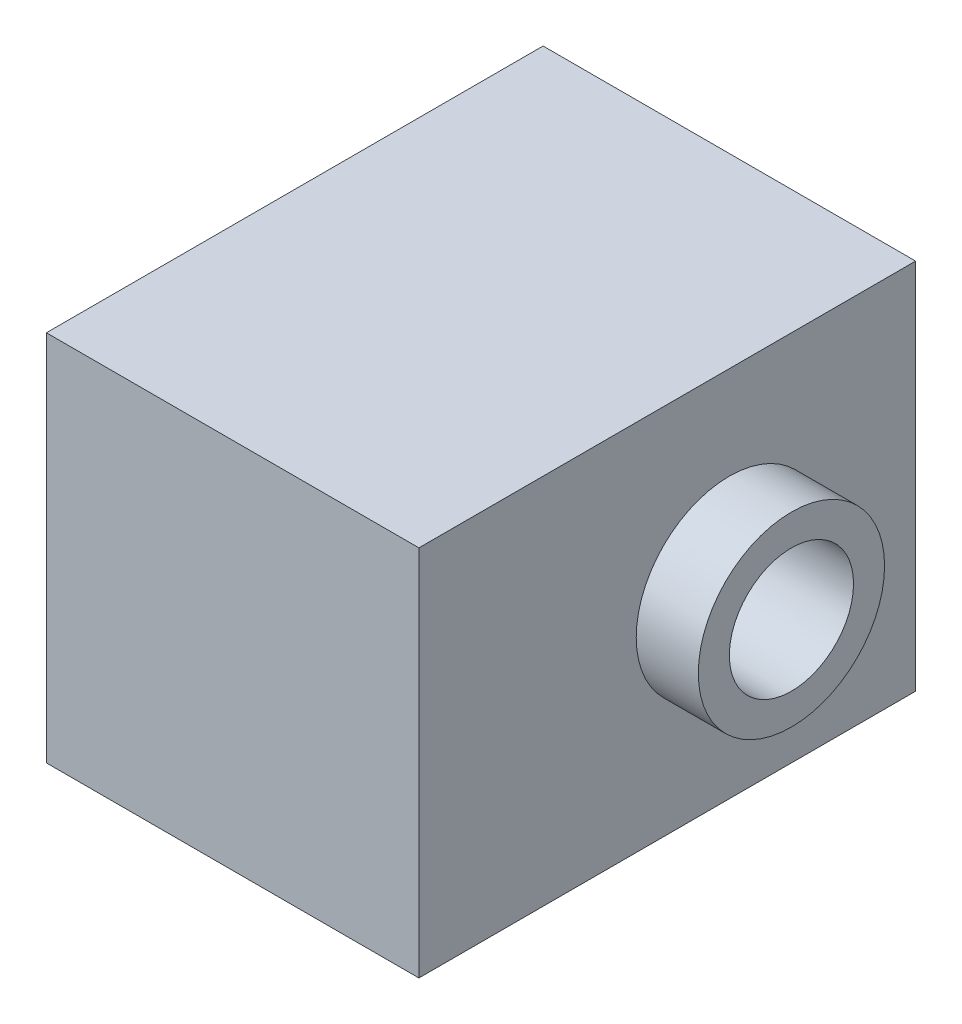
ISO-10303-21;
HEADER;
FILE_DESCRIPTION(('STEP AP214'),'2;1');
FILE_NAME('part.step','',(''),(''),'','','');
FILE_SCHEMA(('AUTOMOTIVE_DESIGN { 1 0 10303 214 1 1 1 1 }'));
ENDSEC;
DATA;
#1=APPLICATION_CONTEXT('core data for automotive mechanical design processes');
#2=APPLICATION_PROTOCOL_DEFINITION('international standard','automotive_design',2000,#1);
#3=PRODUCT_CONTEXT('',#1,'mechanical');
#4=PRODUCT('Part','Part','',(#3));
#5=PRODUCT_RELATED_PRODUCT_CATEGORY('part','',(#4));
#6=PRODUCT_DEFINITION_FORMATION('','',#4);
#7=PRODUCT_DEFINITION_CONTEXT('part definition',#1,'design');
#8=PRODUCT_DEFINITION('design','',#6,#7);
#9=PRODUCT_DEFINITION_SHAPE('','',#8);
#10=(LENGTH_UNIT() NAMED_UNIT(*) SI_UNIT(.MILLI.,.METRE.));
#11=(NAMED_UNIT(*) PLANE_ANGLE_UNIT() SI_UNIT($,.RADIAN.));
#12=(NAMED_UNIT(*) SI_UNIT($,.STERADIAN.) SOLID_ANGLE_UNIT());
#13=UNCERTAINTY_MEASURE_WITH_UNIT(LENGTH_MEASURE(1.E-05),#10,'distance_accuracy_value','');
#14=(GEOMETRIC_REPRESENTATION_CONTEXT(3) GLOBAL_UNCERTAINTY_ASSIGNED_CONTEXT((#13)) GLOBAL_UNIT_ASSIGNED_CONTEXT((#10,
#11,#12)) REPRESENTATION_CONTEXT('',''));
#15=CARTESIAN_POINT('',(0.,0.,0.));
#16=DIRECTION('',(0.,0.,1.));
#17=DIRECTION('',(1.,0.,0.));
#18=AXIS2_PLACEMENT_3D('',#15,#16,#17);
#19=CARTESIAN_POINT('',(-30.,-15.,20.));
#20=DIRECTION('',(0.,0.,1.));
#21=DIRECTION('',(1.,0.,0.));
#22=AXIS2_PLACEMENT_3D('',#19,#20,#21);
#23=PLANE('',#22);
#24=DIRECTION('',(0.,-1.,0.));
#25=VECTOR('',#24,1.);
#26=CARTESIAN_POINT('',(0.,-15.,20.));
#27=LINE('',#26,#25);
#28=CARTESIAN_POINT('',(0.,15.,20.));
#29=VERTEX_POINT('',#28);
#30=CARTESIAN_POINT('',(0.,-15.,20.));
#31=VERTEX_POINT('',#30);
#32=EDGE_CURVE('E98',#29,#31,#27,.T.);
#33=ORIENTED_EDGE('',*,*,#32,.F.);
#34=DIRECTION('',(1.,0.,0.));
#35=VECTOR('',#34,1.);
#36=CARTESIAN_POINT('',(-30.,15.,20.));
#37=LINE('',#36,#35);
#38=CARTESIAN_POINT('',(-30.,15.,20.));
#39=VERTEX_POINT('',#38);
#40=EDGE_CURVE('E11',#39,#29,#37,.T.);
#41=ORIENTED_EDGE('',*,*,#40,.F.);
#42=DIRECTION('',(0.,-1.,0.));
#43=VECTOR('',#42,1.);
#44=CARTESIAN_POINT('',(-30.,-15.,20.));
#45=LINE('',#44,#43);
#46=CARTESIAN_POINT('',(-30.,-15.,20.));
#47=VERTEX_POINT('',#46);
#48=EDGE_CURVE('E91',#39,#47,#45,.T.);
#49=ORIENTED_EDGE('',*,*,#48,.T.);
#50=DIRECTION('',(1.,0.,0.));
#51=VECTOR('',#50,1.);
#52=CARTESIAN_POINT('',(-30.,-15.,20.));
#53=LINE('',#52,#51);
#54=EDGE_CURVE('E36',#47,#31,#53,.T.);
#55=ORIENTED_EDGE('',*,*,#54,.T.);
#56=EDGE_LOOP('',(#33,#41,#49,#55));
#57=FACE_BOUND('',#56,.T.);
#58=ADVANCED_FACE('F33',(#57),#23,.T.);
#59=CARTESIAN_POINT('',(-30.,15.,-20.));
#60=DIRECTION('',(0.,1.,0.));
#61=DIRECTION('',(0.,0.,1.));
#62=AXIS2_PLACEMENT_3D('',#59,#60,#61);
#63=PLANE('',#62);
#64=DIRECTION('',(0.,0.,1.));
#65=VECTOR('',#64,1.);
#66=CARTESIAN_POINT('',(0.,15.,-20.));
#67=LINE('',#66,#65);
#68=CARTESIAN_POINT('',(0.,15.,-20.));
#69=VERTEX_POINT('',#68);
#70=EDGE_CURVE('E93',#69,#29,#67,.T.);
#71=ORIENTED_EDGE('',*,*,#70,.F.);
#72=DIRECTION('',(1.,0.,0.));
#73=VECTOR('',#72,1.);
#74=CARTESIAN_POINT('',(-30.,15.,-20.));
#75=LINE('',#74,#73);
#76=CARTESIAN_POINT('',(-30.,15.,-20.));
#77=VERTEX_POINT('',#76);
#78=EDGE_CURVE('E42',#77,#69,#75,.T.);
#79=ORIENTED_EDGE('',*,*,#78,.F.);
#80=DIRECTION('',(0.,0.,1.));
#81=VECTOR('',#80,1.);
#82=CARTESIAN_POINT('',(-30.,15.,-20.));
#83=LINE('',#82,#81);
#84=EDGE_CURVE('E88',#77,#39,#83,.T.);
#85=ORIENTED_EDGE('',*,*,#84,.T.);
#86=ORIENTED_EDGE('',*,*,#40,.T.);
#87=EDGE_LOOP('',(#71,#79,#85,#86));
#88=FACE_BOUND('',#87,.T.);
#89=ADVANCED_FACE('F109',(#88),#63,.T.);
#90=CARTESIAN_POINT('',(-30.,-15.,-20.));
#91=DIRECTION('',(0.,0.,-1.));
#92=DIRECTION('',(0.,1.,0.));
#93=AXIS2_PLACEMENT_3D('',#90,#91,#92);
#94=PLANE('',#93);
#95=DIRECTION('',(0.,1.,0.));
#96=VECTOR('',#95,1.);
#97=CARTESIAN_POINT('',(0.,-15.,-20.));
#98=LINE('',#97,#96);
#99=CARTESIAN_POINT('',(0.,-15.,-20.));
#100=VERTEX_POINT('',#99);
#101=EDGE_CURVE('E83',#100,#69,#98,.T.);
#102=ORIENTED_EDGE('',*,*,#101,.F.);
#103=DIRECTION('',(1.,0.,0.));
#104=VECTOR('',#103,1.);
#105=CARTESIAN_POINT('',(-30.,-15.,-20.));
#106=LINE('',#105,#104);
#107=CARTESIAN_POINT('',(-30.,-15.,-20.));
#108=VERTEX_POINT('',#107);
#109=EDGE_CURVE('E78',#108,#100,#106,.T.);
#110=ORIENTED_EDGE('',*,*,#109,.F.);
#111=DIRECTION('',(0.,1.,0.));
#112=VECTOR('',#111,1.);
#113=CARTESIAN_POINT('',(-30.,-15.,-20.));
#114=LINE('',#113,#112);
#115=EDGE_CURVE('E81',#108,#77,#114,.T.);
#116=ORIENTED_EDGE('',*,*,#115,.T.);
#117=ORIENTED_EDGE('',*,*,#78,.T.);
#118=EDGE_LOOP('',(#102,#110,#116,#117));
#119=FACE_BOUND('',#118,.T.);
#120=ADVANCED_FACE('F80',(#119),#94,.T.);
#121=CARTESIAN_POINT('',(-30.,-15.,-20.));
#122=DIRECTION('',(0.,-1.,0.));
#123=DIRECTION('',(0.,0.,-1.));
#124=AXIS2_PLACEMENT_3D('',#121,#122,#123);
#125=PLANE('',#124);
#126=DIRECTION('',(0.,0.,-1.));
#127=VECTOR('',#126,1.);
#128=CARTESIAN_POINT('',(0.,-15.,-20.));
#129=LINE('',#128,#127);
#130=EDGE_CURVE('E101',#31,#100,#129,.T.);
#131=ORIENTED_EDGE('',*,*,#130,.F.);
#132=ORIENTED_EDGE('',*,*,#54,.F.);
#133=DIRECTION('',(0.,0.,-1.));
#134=VECTOR('',#133,1.);
#135=CARTESIAN_POINT('',(-30.,-15.,-20.));
#136=LINE('',#135,#134);
#137=EDGE_CURVE('E87',#47,#108,#136,.T.);
#138=ORIENTED_EDGE('',*,*,#137,.T.);
#139=ORIENTED_EDGE('',*,*,#109,.T.);
#140=EDGE_LOOP('',(#131,#132,#138,#139));
#141=FACE_BOUND('',#140,.T.);
#142=ADVANCED_FACE('F90',(#141),#125,.T.);
#143=CARTESIAN_POINT('',(-30.,0.,0.));
#144=DIRECTION('',(1.,0.,0.));
#145=DIRECTION('',(0.,0.,-1.));
#146=AXIS2_PLACEMENT_3D('',#143,#144,#145);
#147=PLANE('',#146);
#148=CARTESIAN_POINT('',(-30.,0.,-5.));
#149=DIRECTION('',(1.,0.,0.));
#150=DIRECTION('',(0.,0.,-1.));
#151=AXIS2_PLACEMENT_3D('',#148,#149,#150);
#152=CIRCLE('',#151,5.);
#153=CARTESIAN_POINT('',(-30.,0.,-10.));
#154=VERTEX_POINT('',#153);
#155=EDGE_CURVE('E148',#154,#154,#152,.T.);
#156=ORIENTED_EDGE('',*,*,#155,.T.);
#157=EDGE_LOOP('',(#156));
#158=FACE_BOUND('',#157,.T.);
#159=ORIENTED_EDGE('',*,*,#48,.F.);
#160=ORIENTED_EDGE('',*,*,#84,.F.);
#161=ORIENTED_EDGE('',*,*,#115,.F.);
#162=ORIENTED_EDGE('',*,*,#137,.F.);
#163=EDGE_LOOP('',(#159,#160,#161,#162));
#164=FACE_BOUND('',#163,.T.);
#165=ADVANCED_FACE('F86',(#158,#164),#147,.F.);
#166=CARTESIAN_POINT('',(0.,0.,0.));
#167=DIRECTION('',(1.,0.,0.));
#168=DIRECTION('',(0.,0.,-1.));
#169=AXIS2_PLACEMENT_3D('',#166,#167,#168);
#170=PLANE('',#169);
#171=CARTESIAN_POINT('',(0.,0.,-5.));
#172=DIRECTION('',(1.,0.,0.));
#173=DIRECTION('',(0.,0.,-1.));
#174=AXIS2_PLACEMENT_3D('',#171,#172,#173);
#175=CIRCLE('',#174,7.5);
#176=CARTESIAN_POINT('',(0.,0.,-12.5));
#177=VERTEX_POINT('',#176);
#178=EDGE_CURVE('E150',#177,#177,#175,.T.);
#179=ORIENTED_EDGE('',*,*,#178,.F.);
#180=EDGE_LOOP('',(#179));
#181=FACE_BOUND('',#180,.T.);
#182=ORIENTED_EDGE('',*,*,#32,.T.);
#183=ORIENTED_EDGE('',*,*,#130,.T.);
#184=ORIENTED_EDGE('',*,*,#101,.T.);
#185=ORIENTED_EDGE('',*,*,#70,.T.);
#186=EDGE_LOOP('',(#182,#183,#184,#185));
#187=FACE_BOUND('',#186,.T.);
#188=ADVANCED_FACE('F108',(#181,#187),#170,.T.);
#189=CARTESIAN_POINT('',(5.,0.,-5.));
#190=DIRECTION('',(1.,0.,0.));
#191=DIRECTION('',(0.,0.,-1.));
#192=AXIS2_PLACEMENT_3D('',#189,#190,#191);
#193=PLANE('',#192);
#194=CARTESIAN_POINT('',(5.,0.,-5.));
#195=DIRECTION('',(1.,0.,0.));
#196=DIRECTION('',(0.,0.,-1.));
#197=AXIS2_PLACEMENT_3D('',#194,#195,#196);
#198=CIRCLE('',#197,7.5);
#199=CARTESIAN_POINT('',(5.,0.,-12.5));
#200=VERTEX_POINT('',#199);
#201=EDGE_CURVE('E102',#200,#200,#198,.T.);
#202=ORIENTED_EDGE('',*,*,#201,.T.);
#203=EDGE_LOOP('',(#202));
#204=FACE_BOUND('',#203,.T.);
#205=CARTESIAN_POINT('',(5.,0.,-5.));
#206=DIRECTION('',(1.,0.,0.));
#207=DIRECTION('',(0.,0.,-1.));
#208=AXIS2_PLACEMENT_3D('',#205,#206,#207);
#209=CIRCLE('',#208,5.);
#210=CARTESIAN_POINT('',(5.,0.,-10.));
#211=VERTEX_POINT('',#210);
#212=EDGE_CURVE('E146',#211,#211,#209,.T.);
#213=ORIENTED_EDGE('',*,*,#212,.F.);
#214=EDGE_LOOP('',(#213));
#215=FACE_BOUND('',#214,.T.);
#216=ADVANCED_FACE('F127',(#204,#215),#193,.T.);
#217=CARTESIAN_POINT('',(5.,0.,-5.));
#218=DIRECTION('',(-1.,0.,0.));
#219=DIRECTION('',(0.,0.,1.));
#220=AXIS2_PLACEMENT_3D('',#217,#218,#219);
#221=CYLINDRICAL_SURFACE('',#220,7.5);
#222=ORIENTED_EDGE('',*,*,#201,.F.);
#223=EDGE_LOOP('',(#222));
#224=FACE_BOUND('',#223,.T.);
#225=ORIENTED_EDGE('',*,*,#178,.T.);
#226=EDGE_LOOP('',(#225));
#227=FACE_BOUND('',#226,.T.);
#228=ADVANCED_FACE('F131',(#224,#227),#221,.T.);
#229=CARTESIAN_POINT('',(5.,0.,-5.));
#230=DIRECTION('',(-1.,0.,0.));
#231=DIRECTION('',(0.,0.,1.));
#232=AXIS2_PLACEMENT_3D('',#229,#230,#231);
#233=CYLINDRICAL_SURFACE('',#232,5.);
#234=ORIENTED_EDGE('',*,*,#212,.T.);
#235=EDGE_LOOP('',(#234));
#236=FACE_BOUND('',#235,.T.);
#237=ORIENTED_EDGE('',*,*,#155,.F.);
#238=EDGE_LOOP('',(#237));
#239=FACE_BOUND('',#238,.T.);
#240=ADVANCED_FACE('F134',(#236,#239),#233,.F.);
#241=CLOSED_SHELL('',(#58,#89,#120,#142,#165,#188,#216,#228,#240));
#242=MANIFOLD_SOLID_BREP('B2',#241);
#243=ADVANCED_BREP_SHAPE_REPRESENTATION('',(#18,#242),#14);
#244=SHAPE_DEFINITION_REPRESENTATION(#9,#243);
ENDSEC;
END-ISO-10303-21;
